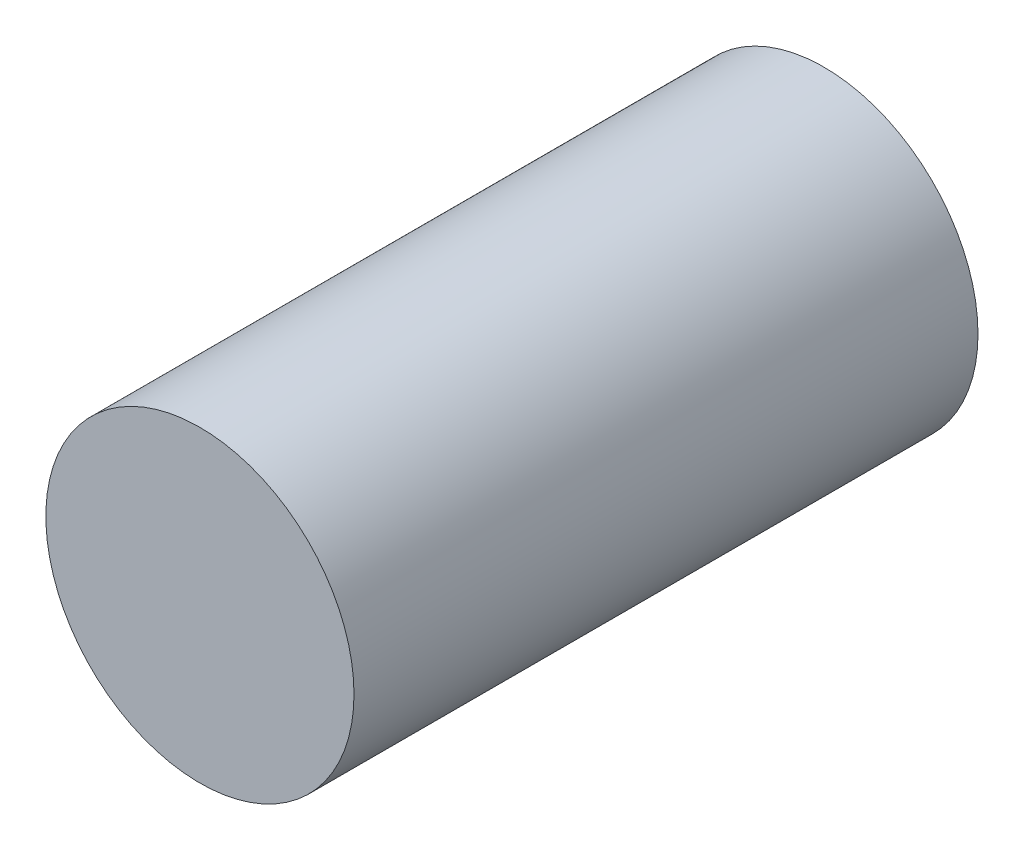
ISO-10303-21;
HEADER;
FILE_DESCRIPTION(('STEP AP214'),'2;1');
FILE_NAME('part.step','',(''),(''),'','','');
FILE_SCHEMA(('AUTOMOTIVE_DESIGN { 1 0 10303 214 1 1 1 1 }'));
ENDSEC;
DATA;
#1=APPLICATION_CONTEXT('core data for automotive mechanical design processes');
#2=APPLICATION_PROTOCOL_DEFINITION('international standard','automotive_design',2000,#1);
#3=PRODUCT_CONTEXT('',#1,'mechanical');
#4=PRODUCT('Part','Part','',(#3));
#5=PRODUCT_RELATED_PRODUCT_CATEGORY('part','',(#4));
#6=PRODUCT_DEFINITION_FORMATION('','',#4);
#7=PRODUCT_DEFINITION_CONTEXT('part definition',#1,'design');
#8=PRODUCT_DEFINITION('design','',#6,#7);
#9=PRODUCT_DEFINITION_SHAPE('','',#8);
#10=(LENGTH_UNIT() NAMED_UNIT(*) SI_UNIT(.MILLI.,.METRE.));
#11=(NAMED_UNIT(*) PLANE_ANGLE_UNIT() SI_UNIT($,.RADIAN.));
#12=(NAMED_UNIT(*) SI_UNIT($,.STERADIAN.) SOLID_ANGLE_UNIT());
#13=UNCERTAINTY_MEASURE_WITH_UNIT(LENGTH_MEASURE(1.E-05),#10,'distance_accuracy_value','');
#14=(GEOMETRIC_REPRESENTATION_CONTEXT(3) GLOBAL_UNCERTAINTY_ASSIGNED_CONTEXT((#13)) GLOBAL_UNIT_ASSIGNED_CONTEXT((#10,
#11,#12)) REPRESENTATION_CONTEXT('',''));
#15=CARTESIAN_POINT('',(0.,0.,0.));
#16=DIRECTION('',(0.,0.,1.));
#17=DIRECTION('',(1.,0.,0.));
#18=AXIS2_PLACEMENT_3D('',#15,#16,#17);
#19=CARTESIAN_POINT('',(-110.132843176068,48.968462150433,8.1));
#20=DIRECTION('',(0.,0.,-1.));
#21=DIRECTION('',(-1.,0.,0.));
#22=AXIS2_PLACEMENT_3D('',#19,#20,#21);
#23=CYLINDRICAL_SURFACE('',#22,2.);
#24=CARTESIAN_POINT('',(-110.132843176068,48.968462150433,8.1));
#25=DIRECTION('',(0.,0.,1.));
#26=DIRECTION('',(1.,0.,0.));
#27=AXIS2_PLACEMENT_3D('',#24,#25,#26);
#28=CIRCLE('',#27,2.);
#29=CARTESIAN_POINT('',(-108.132843176068,48.968462150433,8.1));
#30=VERTEX_POINT('',#29);
#31=EDGE_CURVE('E10',#30,#30,#28,.T.);
#32=ORIENTED_EDGE('',*,*,#31,.F.);
#33=EDGE_LOOP('',(#32));
#34=FACE_BOUND('',#33,.T.);
#35=CARTESIAN_POINT('',(-110.132843176068,48.968462150433,0.));
#36=DIRECTION('',(0.,0.,1.));
#37=DIRECTION('',(1.,0.,0.));
#38=AXIS2_PLACEMENT_3D('',#35,#36,#37);
#39=CIRCLE('',#38,2.);
#40=CARTESIAN_POINT('',(-108.132843176068,48.968462150433,0.));
#41=VERTEX_POINT('',#40);
#42=EDGE_CURVE('E38',#41,#41,#39,.T.);
#43=ORIENTED_EDGE('',*,*,#42,.T.);
#44=EDGE_LOOP('',(#43));
#45=FACE_BOUND('',#44,.T.);
#46=ADVANCED_FACE('F35',(#34,#45),#23,.T.);
#47=CARTESIAN_POINT('',(-110.132843176068,48.968462150433,8.1));
#48=DIRECTION('',(0.,0.,1.));
#49=DIRECTION('',(1.,0.,0.));
#50=AXIS2_PLACEMENT_3D('',#47,#48,#49);
#51=PLANE('',#50);
#52=ORIENTED_EDGE('',*,*,#31,.T.);
#53=EDGE_LOOP('',(#52));
#54=FACE_BOUND('',#53,.T.);
#55=ADVANCED_FACE('F50',(#54),#51,.T.);
#56=CARTESIAN_POINT('',(-110.132843176068,48.968462150433,0.));
#57=DIRECTION('',(0.,0.,1.));
#58=DIRECTION('',(1.,0.,0.));
#59=AXIS2_PLACEMENT_3D('',#56,#57,#58);
#60=PLANE('',#59);
#61=ORIENTED_EDGE('',*,*,#42,.F.);
#62=EDGE_LOOP('',(#61));
#63=FACE_BOUND('',#62,.T.);
#64=ADVANCED_FACE('F48',(#63),#60,.F.);
#65=CLOSED_SHELL('',(#46,#55,#64));
#66=MANIFOLD_SOLID_BREP('B2',#65);
#67=ADVANCED_BREP_SHAPE_REPRESENTATION('',(#18,#66),#14);
#68=SHAPE_DEFINITION_REPRESENTATION(#9,#67);
ENDSEC;
END-ISO-10303-21;
